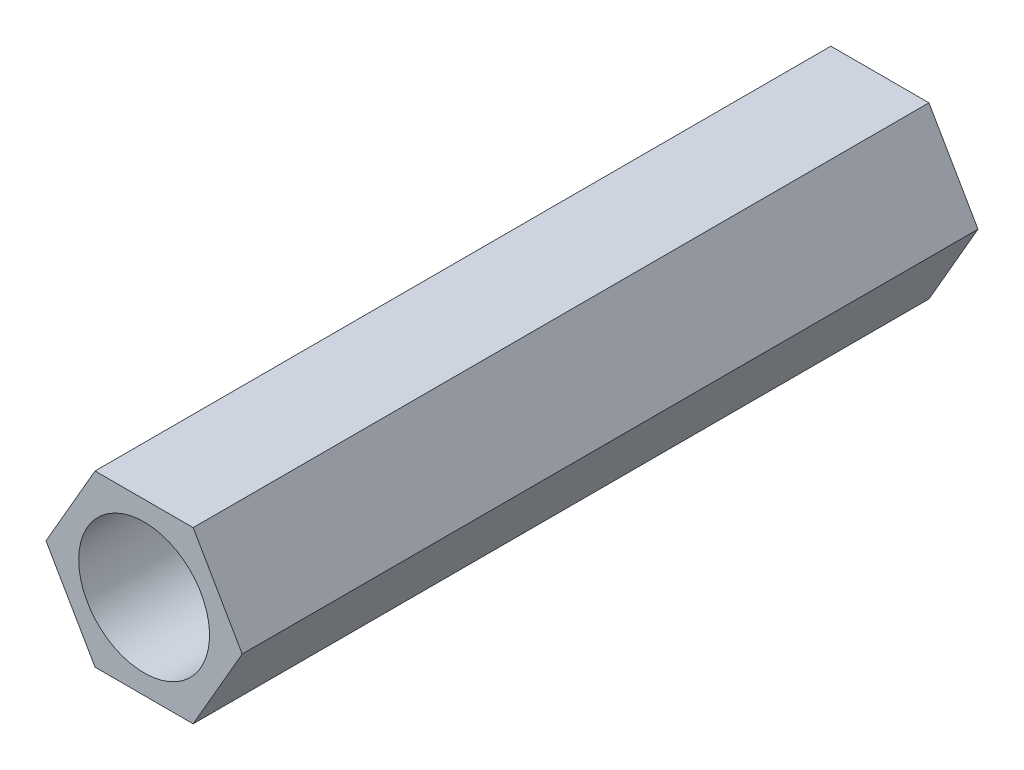
ISO-10303-21;
HEADER;
FILE_DESCRIPTION(('STEP AP214'),'2;1');
FILE_NAME('part.step','',(''),(''),'','','');
FILE_SCHEMA(('AUTOMOTIVE_DESIGN { 1 0 10303 214 1 1 1 1 }'));
ENDSEC;
DATA;
#1=APPLICATION_CONTEXT('core data for automotive mechanical design processes');
#2=APPLICATION_PROTOCOL_DEFINITION('international standard','automotive_design',2000,#1);
#3=PRODUCT_CONTEXT('',#1,'mechanical');
#4=PRODUCT('Part','Part','',(#3));
#5=PRODUCT_RELATED_PRODUCT_CATEGORY('part','',(#4));
#6=PRODUCT_DEFINITION_FORMATION('','',#4);
#7=PRODUCT_DEFINITION_CONTEXT('part definition',#1,'design');
#8=PRODUCT_DEFINITION('design','',#6,#7);
#9=PRODUCT_DEFINITION_SHAPE('','',#8);
#10=(LENGTH_UNIT() NAMED_UNIT(*) SI_UNIT(.MILLI.,.METRE.));
#11=(NAMED_UNIT(*) PLANE_ANGLE_UNIT() SI_UNIT($,.RADIAN.));
#12=(NAMED_UNIT(*) SI_UNIT($,.STERADIAN.) SOLID_ANGLE_UNIT());
#13=UNCERTAINTY_MEASURE_WITH_UNIT(LENGTH_MEASURE(1.E-05),#10,'distance_accuracy_value','');
#14=(GEOMETRIC_REPRESENTATION_CONTEXT(3) GLOBAL_UNCERTAINTY_ASSIGNED_CONTEXT((#13)) GLOBAL_UNIT_ASSIGNED_CONTEXT((#10,
#11,#12)) REPRESENTATION_CONTEXT('',''));
#15=CARTESIAN_POINT('',(0.,0.,0.));
#16=DIRECTION('',(0.,0.,1.));
#17=DIRECTION('',(1.,0.,0.));
#18=AXIS2_PLACEMENT_3D('',#15,#16,#17);
#19=CARTESIAN_POINT('',(1.50000000000014,-2.59807621135308,22.5));
#20=DIRECTION('',(0.,-1.,0.));
#21=DIRECTION('',(0.,0.,-1.));
#22=AXIS2_PLACEMENT_3D('',#19,#20,#21);
#23=PLANE('',#22);
#24=DIRECTION('',(-1.,0.,0.));
#25=VECTOR('',#24,1.);
#26=CARTESIAN_POINT('',(1.50000000000014,-2.59807621135308,0.));
#27=LINE('',#26,#25);
#28=CARTESIAN_POINT('',(1.50000000000014,-2.59807621135308,0.));
#29=VERTEX_POINT('',#28);
#30=CARTESIAN_POINT('',(-1.49999999999986,-2.59807621135308,0.));
#31=VERTEX_POINT('',#30);
#32=EDGE_CURVE('E126',#29,#31,#27,.T.);
#33=ORIENTED_EDGE('',*,*,#32,.F.);
#34=DIRECTION('',(0.,0.,-1.));
#35=VECTOR('',#34,1.);
#36=CARTESIAN_POINT('',(1.50000000000014,-2.59807621135308,22.5));
#37=LINE('',#36,#35);
#38=CARTESIAN_POINT('',(1.50000000000014,-2.59807621135308,22.5));
#39=VERTEX_POINT('',#38);
#40=EDGE_CURVE('E11',#39,#29,#37,.T.);
#41=ORIENTED_EDGE('',*,*,#40,.F.);
#42=DIRECTION('',(-1.,0.,0.));
#43=VECTOR('',#42,1.);
#44=CARTESIAN_POINT('',(1.50000000000014,-2.59807621135308,22.5));
#45=LINE('',#44,#43);
#46=CARTESIAN_POINT('',(-1.49999999999986,-2.59807621135308,22.5));
#47=VERTEX_POINT('',#46);
#48=EDGE_CURVE('E141',#39,#47,#45,.T.);
#49=ORIENTED_EDGE('',*,*,#48,.T.);
#50=DIRECTION('',(0.,0.,-1.));
#51=VECTOR('',#50,1.);
#52=CARTESIAN_POINT('',(-1.49999999999986,-2.59807621135308,22.5));
#53=LINE('',#52,#51);
#54=EDGE_CURVE('E44',#47,#31,#53,.T.);
#55=ORIENTED_EDGE('',*,*,#54,.T.);
#56=EDGE_LOOP('',(#33,#41,#49,#55));
#57=FACE_BOUND('',#56,.T.);
#58=ADVANCED_FACE('F41',(#57),#23,.T.);
#59=CARTESIAN_POINT('',(3.,0.,22.5));
#60=DIRECTION('',(0.866025403784439,-0.5,0.));
#61=DIRECTION('',(0.5,0.866025403784439,0.));
#62=AXIS2_PLACEMENT_3D('',#59,#60,#61);
#63=PLANE('',#62);
#64=DIRECTION('',(-0.5,-0.866025403784439,0.));
#65=VECTOR('',#64,1.);
#66=CARTESIAN_POINT('',(3.,0.,0.));
#67=LINE('',#66,#65);
#68=CARTESIAN_POINT('',(3.,0.,0.));
#69=VERTEX_POINT('',#68);
#70=EDGE_CURVE('E139',#69,#29,#67,.T.);
#71=ORIENTED_EDGE('',*,*,#70,.F.);
#72=DIRECTION('',(0.,0.,-1.));
#73=VECTOR('',#72,1.);
#74=CARTESIAN_POINT('',(3.,0.,22.5));
#75=LINE('',#74,#73);
#76=CARTESIAN_POINT('',(3.,0.,22.5));
#77=VERTEX_POINT('',#76);
#78=EDGE_CURVE('E50',#77,#69,#75,.T.);
#79=ORIENTED_EDGE('',*,*,#78,.F.);
#80=DIRECTION('',(-0.5,-0.866025403784439,0.));
#81=VECTOR('',#80,1.);
#82=CARTESIAN_POINT('',(3.,0.,22.5));
#83=LINE('',#82,#81);
#84=EDGE_CURVE('E116',#77,#39,#83,.T.);
#85=ORIENTED_EDGE('',*,*,#84,.T.);
#86=ORIENTED_EDGE('',*,*,#40,.T.);
#87=EDGE_LOOP('',(#71,#79,#85,#86));
#88=FACE_BOUND('',#87,.T.);
#89=ADVANCED_FACE('F149',(#88),#63,.T.);
#90=CARTESIAN_POINT('',(1.50000000000014,2.59807621135308,22.5));
#91=DIRECTION('',(0.866025403784439,0.5,0.));
#92=DIRECTION('',(-0.5,0.866025403784439,0.));
#93=AXIS2_PLACEMENT_3D('',#90,#91,#92);
#94=PLANE('',#93);
#95=DIRECTION('',(0.5,-0.866025403784439,0.));
#96=VECTOR('',#95,1.);
#97=CARTESIAN_POINT('',(1.50000000000014,2.59807621135308,0.));
#98=LINE('',#97,#96);
#99=CARTESIAN_POINT('',(1.50000000000014,2.59807621135308,0.));
#100=VERTEX_POINT('',#99);
#101=EDGE_CURVE('E103',#100,#69,#98,.T.);
#102=ORIENTED_EDGE('',*,*,#101,.F.);
#103=DIRECTION('',(0.,0.,-1.));
#104=VECTOR('',#103,1.);
#105=CARTESIAN_POINT('',(1.50000000000014,2.59807621135308,22.5));
#106=LINE('',#105,#104);
#107=CARTESIAN_POINT('',(1.50000000000014,2.59807621135308,22.5));
#108=VERTEX_POINT('',#107);
#109=EDGE_CURVE('E98',#108,#100,#106,.T.);
#110=ORIENTED_EDGE('',*,*,#109,.F.);
#111=DIRECTION('',(0.5,-0.866025403784439,0.));
#112=VECTOR('',#111,1.);
#113=CARTESIAN_POINT('',(1.50000000000014,2.59807621135308,22.5));
#114=LINE('',#113,#112);
#115=EDGE_CURVE('E101',#108,#77,#114,.T.);
#116=ORIENTED_EDGE('',*,*,#115,.T.);
#117=ORIENTED_EDGE('',*,*,#78,.T.);
#118=EDGE_LOOP('',(#102,#110,#116,#117));
#119=FACE_BOUND('',#118,.T.);
#120=ADVANCED_FACE('F100',(#119),#94,.T.);
#121=CARTESIAN_POINT('',(-1.49999999999986,2.59807621135308,22.5));
#122=DIRECTION('',(0.,1.,0.));
#123=DIRECTION('',(0.,0.,1.));
#124=AXIS2_PLACEMENT_3D('',#121,#122,#123);
#125=PLANE('',#124);
#126=DIRECTION('',(1.,0.,0.));
#127=VECTOR('',#126,1.);
#128=CARTESIAN_POINT('',(-1.49999999999986,2.59807621135308,0.));
#129=LINE('',#128,#127);
#130=CARTESIAN_POINT('',(-1.49999999999986,2.59807621135308,0.));
#131=VERTEX_POINT('',#130);
#132=EDGE_CURVE('E136',#131,#100,#129,.T.);
#133=ORIENTED_EDGE('',*,*,#132,.F.);
#134=DIRECTION('',(0.,0.,-1.));
#135=VECTOR('',#134,1.);
#136=CARTESIAN_POINT('',(-1.49999999999986,2.59807621135308,22.5));
#137=LINE('',#136,#135);
#138=CARTESIAN_POINT('',(-1.49999999999986,2.59807621135308,22.5));
#139=VERTEX_POINT('',#138);
#140=EDGE_CURVE('E108',#139,#131,#137,.T.);
#141=ORIENTED_EDGE('',*,*,#140,.F.);
#142=DIRECTION('',(1.,0.,0.));
#143=VECTOR('',#142,1.);
#144=CARTESIAN_POINT('',(-1.49999999999986,2.59807621135308,22.5));
#145=LINE('',#144,#143);
#146=EDGE_CURVE('E114',#139,#108,#145,.T.);
#147=ORIENTED_EDGE('',*,*,#146,.T.);
#148=ORIENTED_EDGE('',*,*,#109,.T.);
#149=EDGE_LOOP('',(#133,#141,#147,#148));
#150=FACE_BOUND('',#149,.T.);
#151=ADVANCED_FACE('F118',(#150),#125,.T.);
#152=CARTESIAN_POINT('',(-2.99999999999973,0.,22.5));
#153=DIRECTION('',(-0.866025403784439,0.5,0.));
#154=DIRECTION('',(-0.5,-0.866025403784439,0.));
#155=AXIS2_PLACEMENT_3D('',#152,#153,#154);
#156=PLANE('',#155);
#157=DIRECTION('',(0.5,0.866025403784439,0.));
#158=VECTOR('',#157,1.);
#159=CARTESIAN_POINT('',(-2.99999999999973,0.,0.));
#160=LINE('',#159,#158);
#161=CARTESIAN_POINT('',(-2.99999999999973,0.,0.));
#162=VERTEX_POINT('',#161);
#163=EDGE_CURVE('E133',#162,#131,#160,.T.);
#164=ORIENTED_EDGE('',*,*,#163,.F.);
#165=DIRECTION('',(0.,0.,-1.));
#166=VECTOR('',#165,1.);
#167=CARTESIAN_POINT('',(-2.99999999999973,0.,22.5));
#168=LINE('',#167,#166);
#169=CARTESIAN_POINT('',(-2.99999999999973,0.,22.5));
#170=VERTEX_POINT('',#169);
#171=EDGE_CURVE('E144',#170,#162,#168,.T.);
#172=ORIENTED_EDGE('',*,*,#171,.F.);
#173=DIRECTION('',(0.5,0.866025403784439,0.));
#174=VECTOR('',#173,1.);
#175=CARTESIAN_POINT('',(-2.99999999999973,0.,22.5));
#176=LINE('',#175,#174);
#177=EDGE_CURVE('E119',#170,#139,#176,.T.);
#178=ORIENTED_EDGE('',*,*,#177,.T.);
#179=ORIENTED_EDGE('',*,*,#140,.T.);
#180=EDGE_LOOP('',(#164,#172,#178,#179));
#181=FACE_BOUND('',#180,.T.);
#182=ADVANCED_FACE('F162',(#181),#156,.T.);
#183=CARTESIAN_POINT('',(-1.49999999999986,-2.59807621135308,22.5));
#184=DIRECTION('',(-0.866025403784439,-0.5,0.));
#185=DIRECTION('',(0.5,-0.866025403784439,0.));
#186=AXIS2_PLACEMENT_3D('',#183,#184,#185);
#187=PLANE('',#186);
#188=DIRECTION('',(-0.5,0.866025403784439,0.));
#189=VECTOR('',#188,1.);
#190=CARTESIAN_POINT('',(-1.49999999999986,-2.59807621135308,0.));
#191=LINE('',#190,#189);
#192=EDGE_CURVE('E129',#31,#162,#191,.T.);
#193=ORIENTED_EDGE('',*,*,#192,.F.);
#194=ORIENTED_EDGE('',*,*,#54,.F.);
#195=DIRECTION('',(-0.5,0.866025403784439,0.));
#196=VECTOR('',#195,1.);
#197=CARTESIAN_POINT('',(-1.49999999999986,-2.59807621135308,22.5));
#198=LINE('',#197,#196);
#199=EDGE_CURVE('E121',#47,#170,#198,.T.);
#200=ORIENTED_EDGE('',*,*,#199,.T.);
#201=ORIENTED_EDGE('',*,*,#171,.T.);
#202=EDGE_LOOP('',(#193,#194,#200,#201));
#203=FACE_BOUND('',#202,.T.);
#204=ADVANCED_FACE('F146',(#203),#187,.T.);
#205=CARTESIAN_POINT('',(0.,0.,22.5));
#206=DIRECTION('',(0.,0.,-1.));
#207=DIRECTION('',(-1.,0.,0.));
#208=AXIS2_PLACEMENT_3D('',#205,#206,#207);
#209=PLANE('',#208);
#210=CARTESIAN_POINT('',(0.,0.,22.5));
#211=DIRECTION('',(0.,0.,-1.));
#212=DIRECTION('',(1.,0.,0.));
#213=AXIS2_PLACEMENT_3D('',#210,#211,#212);
#214=CIRCLE('',#213,2.);
#215=CARTESIAN_POINT('',(-2.,0.,22.5));
#216=VERTEX_POINT('',#215);
#217=EDGE_CURVE('E130',#216,#216,#214,.T.);
#218=ORIENTED_EDGE('',*,*,#217,.T.);
#219=EDGE_LOOP('',(#218));
#220=FACE_BOUND('',#219,.T.);
#221=ORIENTED_EDGE('',*,*,#48,.F.);
#222=ORIENTED_EDGE('',*,*,#84,.F.);
#223=ORIENTED_EDGE('',*,*,#115,.F.);
#224=ORIENTED_EDGE('',*,*,#146,.F.);
#225=ORIENTED_EDGE('',*,*,#177,.F.);
#226=ORIENTED_EDGE('',*,*,#199,.F.);
#227=EDGE_LOOP('',(#221,#222,#223,#224,#225,#226));
#228=FACE_BOUND('',#227,.T.);
#229=ADVANCED_FACE('F112',(#220,#228),#209,.F.);
#230=CARTESIAN_POINT('',(0.,0.,0.));
#231=DIRECTION('',(0.,0.,-1.));
#232=DIRECTION('',(-1.,0.,0.));
#233=AXIS2_PLACEMENT_3D('',#230,#231,#232);
#234=PLANE('',#233);
#235=CARTESIAN_POINT('',(0.,0.,0.));
#236=DIRECTION('',(0.,0.,-1.));
#237=DIRECTION('',(1.,0.,0.));
#238=AXIS2_PLACEMENT_3D('',#235,#236,#237);
#239=CIRCLE('',#238,2.);
#240=CARTESIAN_POINT('',(-2.,0.,0.));
#241=VERTEX_POINT('',#240);
#242=EDGE_CURVE('E185',#241,#241,#239,.T.);
#243=ORIENTED_EDGE('',*,*,#242,.F.);
#244=EDGE_LOOP('',(#243));
#245=FACE_BOUND('',#244,.T.);
#246=ORIENTED_EDGE('',*,*,#32,.T.);
#247=ORIENTED_EDGE('',*,*,#192,.T.);
#248=ORIENTED_EDGE('',*,*,#163,.T.);
#249=ORIENTED_EDGE('',*,*,#132,.T.);
#250=ORIENTED_EDGE('',*,*,#101,.T.);
#251=ORIENTED_EDGE('',*,*,#70,.T.);
#252=EDGE_LOOP('',(#246,#247,#248,#249,#250,#251));
#253=FACE_BOUND('',#252,.T.);
#254=ADVANCED_FACE('F148',(#245,#253),#234,.T.);
#255=CARTESIAN_POINT('',(0.,0.,22.5));
#256=DIRECTION('',(0.,0.,-1.));
#257=DIRECTION('',(-1.,0.,0.));
#258=AXIS2_PLACEMENT_3D('',#255,#256,#257);
#259=CYLINDRICAL_SURFACE('',#258,2.);
#260=CARTESIAN_POINT('',(-2.,0.,22.5));
#261=CARTESIAN_POINT('',(-2.,0.,22.265625));
#262=CARTESIAN_POINT('',(-2.,0.,22.03125));
#263=CARTESIAN_POINT('',(-2.,0.,21.5625));
#264=CARTESIAN_POINT('',(-2.,0.,21.328125));
#265=CARTESIAN_POINT('',(-2.,0.,20.859375));
#266=CARTESIAN_POINT('',(-2.,0.,20.625));
#267=CARTESIAN_POINT('',(-2.,0.,20.15625));
#268=CARTESIAN_POINT('',(-2.,0.,19.921875));
#269=CARTESIAN_POINT('',(-2.,0.,19.453125));
#270=CARTESIAN_POINT('',(-2.,0.,19.21875));
#271=CARTESIAN_POINT('',(-2.,0.,18.75));
#272=CARTESIAN_POINT('',(-2.,0.,18.515625));
#273=CARTESIAN_POINT('',(-2.,0.,18.046875));
#274=CARTESIAN_POINT('',(-2.,0.,17.8125));
#275=CARTESIAN_POINT('',(-2.,0.,17.34375));
#276=CARTESIAN_POINT('',(-2.,0.,17.109375));
#277=CARTESIAN_POINT('',(-2.,0.,16.640625));
#278=CARTESIAN_POINT('',(-2.,0.,16.40625));
#279=CARTESIAN_POINT('',(-2.,0.,15.9375));
#280=CARTESIAN_POINT('',(-2.,0.,15.703125));
#281=CARTESIAN_POINT('',(-2.,0.,15.234375));
#282=CARTESIAN_POINT('',(-2.,0.,15.));
#283=CARTESIAN_POINT('',(-2.,0.,14.53125));
#284=CARTESIAN_POINT('',(-2.,0.,14.296875));
#285=CARTESIAN_POINT('',(-2.,0.,13.828125));
#286=CARTESIAN_POINT('',(-2.,0.,13.59375));
#287=CARTESIAN_POINT('',(-2.,0.,13.125));
#288=CARTESIAN_POINT('',(-2.,0.,12.890625));
#289=CARTESIAN_POINT('',(-2.,0.,12.421875));
#290=CARTESIAN_POINT('',(-2.,0.,12.1875));
#291=CARTESIAN_POINT('',(-2.,0.,11.71875));
#292=CARTESIAN_POINT('',(-2.,0.,11.484375));
#293=CARTESIAN_POINT('',(-2.,0.,11.015625));
#294=CARTESIAN_POINT('',(-2.,0.,10.78125));
#295=CARTESIAN_POINT('',(-2.,0.,10.3125));
#296=CARTESIAN_POINT('',(-2.,0.,10.078125));
#297=CARTESIAN_POINT('',(-2.,0.,9.609375));
#298=CARTESIAN_POINT('',(-2.,0.,9.375));
#299=CARTESIAN_POINT('',(-2.,0.,8.90625));
#300=CARTESIAN_POINT('',(-2.,0.,8.671875));
#301=CARTESIAN_POINT('',(-2.,0.,8.203125));
#302=CARTESIAN_POINT('',(-2.,0.,7.96875));
#303=CARTESIAN_POINT('',(-2.,0.,7.5));
#304=CARTESIAN_POINT('',(-2.,0.,7.265625));
#305=CARTESIAN_POINT('',(-2.,0.,6.796875));
#306=CARTESIAN_POINT('',(-2.,0.,6.5625));
#307=CARTESIAN_POINT('',(-2.,0.,6.09375));
#308=CARTESIAN_POINT('',(-2.,0.,5.859375));
#309=CARTESIAN_POINT('',(-2.,0.,5.390625));
#310=CARTESIAN_POINT('',(-2.,0.,5.15625));
#311=CARTESIAN_POINT('',(-2.,0.,4.6875));
#312=CARTESIAN_POINT('',(-2.,0.,4.453125));
#313=CARTESIAN_POINT('',(-2.,0.,3.984375));
#314=CARTESIAN_POINT('',(-2.,0.,3.75));
#315=CARTESIAN_POINT('',(-2.,0.,3.28125));
#316=CARTESIAN_POINT('',(-2.,0.,3.046875));
#317=CARTESIAN_POINT('',(-2.,0.,2.578125));
#318=CARTESIAN_POINT('',(-2.,0.,2.34375));
#319=CARTESIAN_POINT('',(-2.,0.,1.875));
#320=CARTESIAN_POINT('',(-2.,0.,1.640625));
#321=CARTESIAN_POINT('',(-2.,0.,1.171875));
#322=CARTESIAN_POINT('',(-2.,0.,0.937500000000003));
#323=CARTESIAN_POINT('',(-2.,0.,0.468750000000003));
#324=CARTESIAN_POINT('',(-2.,0.,0.234375000000003));
#325=CARTESIAN_POINT('',(-2.,0.,0.));
#326=B_SPLINE_CURVE_WITH_KNOTS('',3,(#260,#261,#262,#263,#264,#265,#266,#267,#268,#269,#270,
#271,#272,#273,#274,#275,#276,#277,#278,#279,#280,#281,#282,#283,#284,#285,#286,#287,#288,#289,
#290,#291,#292,#293,#294,#295,#296,#297,#298,#299,#300,#301,#302,#303,#304,#305,#306,#307,#308,
#309,#310,#311,#312,#313,#314,#315,#316,#317,#318,#319,#320,#321,#322,#323,#324,#325),
.UNSPECIFIED.,.F.,.F.,(4,2,2,2,2,2,2,2,2,2,2,2,2,2,2,2,2,2,2,2,2,2,2,2,2,2,2,2,2,2,2,2,4),(0.,
0.703124999999999,1.40625,2.109375,2.8125,3.515625,4.21875,4.921875,5.625,6.328125,7.03125,
7.734375,8.4375,9.140625,9.84375,10.546875,11.25,11.953125,12.65625,13.359375,14.0625,14.765625,
15.46875,16.171875,16.875,17.578125,18.28125,18.984375,19.6875,20.390625,21.09375,21.796875,
22.5),.UNSPECIFIED.);
#327=EDGE_CURVE('BSEAM173',#216,#241,#326,.T.);
#328=ORIENTED_EDGE('',*,*,#217,.F.);
#329=ORIENTED_EDGE('',*,*,#242,.T.);
#330=ORIENTED_EDGE('',*,*,#327,.T.);
#331=ORIENTED_EDGE('',*,*,#327,.F.);
#332=EDGE_LOOP('',(#328,#330,#329,#331));
#333=FACE_BOUND('',#332,.T.);
#334=ADVANCED_FACE('F173',(#333),#259,.F.);
#335=CLOSED_SHELL('',(#58,#89,#120,#151,#182,#204,#229,#254,#334));
#336=MANIFOLD_SOLID_BREP('B2',#335);
#337=ADVANCED_BREP_SHAPE_REPRESENTATION('',(#18,#336),#14);
#338=SHAPE_DEFINITION_REPRESENTATION(#9,#337);
ENDSEC;
END-ISO-10303-21;
